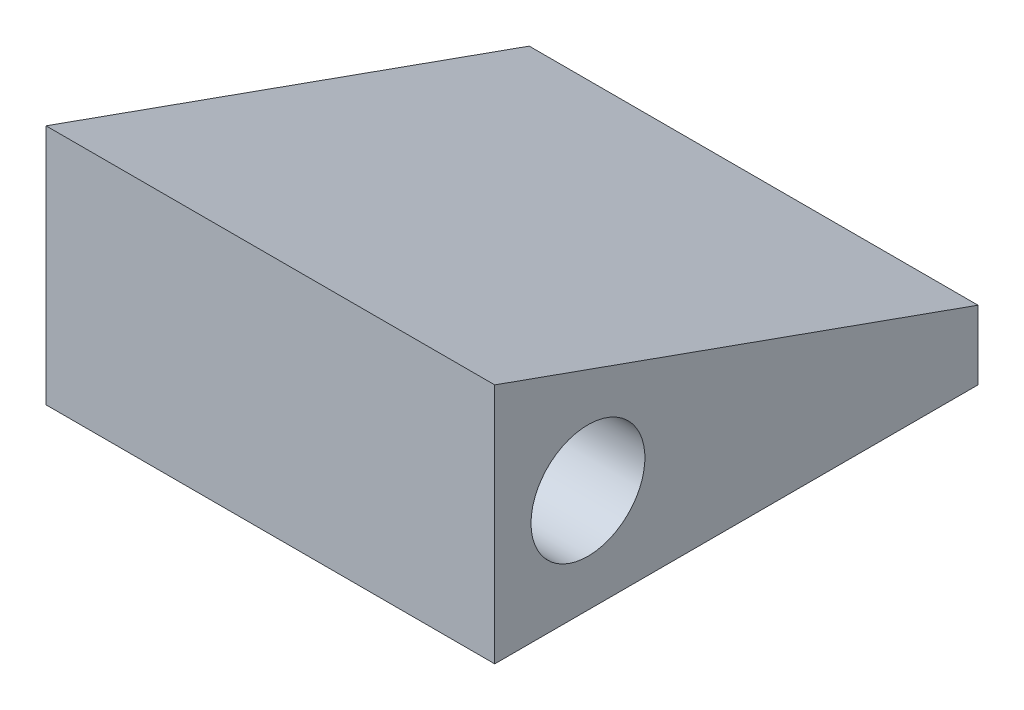
ISO-10303-21;
HEADER;
FILE_DESCRIPTION(('STEP AP214'),'2;1');
FILE_NAME('part.step','',(''),(''),'','','');
FILE_SCHEMA(('AUTOMOTIVE_DESIGN { 1 0 10303 214 1 1 1 1 }'));
ENDSEC;
DATA;
#1=APPLICATION_CONTEXT('core data for automotive mechanical design processes');
#2=APPLICATION_PROTOCOL_DEFINITION('international standard','automotive_design',2000,#1);
#3=PRODUCT_CONTEXT('',#1,'mechanical');
#4=PRODUCT('Part','Part','',(#3));
#5=PRODUCT_RELATED_PRODUCT_CATEGORY('part','',(#4));
#6=PRODUCT_DEFINITION_FORMATION('','',#4);
#7=PRODUCT_DEFINITION_CONTEXT('part definition',#1,'design');
#8=PRODUCT_DEFINITION('design','',#6,#7);
#9=PRODUCT_DEFINITION_SHAPE('','',#8);
#10=(LENGTH_UNIT() NAMED_UNIT(*) SI_UNIT(.MILLI.,.METRE.));
#11=(NAMED_UNIT(*) PLANE_ANGLE_UNIT() SI_UNIT($,.RADIAN.));
#12=(NAMED_UNIT(*) SI_UNIT($,.STERADIAN.) SOLID_ANGLE_UNIT());
#13=UNCERTAINTY_MEASURE_WITH_UNIT(LENGTH_MEASURE(1.E-05),#10,'distance_accuracy_value','');
#14=(GEOMETRIC_REPRESENTATION_CONTEXT(3) GLOBAL_UNCERTAINTY_ASSIGNED_CONTEXT((#13)) GLOBAL_UNIT_ASSIGNED_CONTEXT((#10,
#11,#12)) REPRESENTATION_CONTEXT('',''));
#15=CARTESIAN_POINT('',(0.,0.,0.));
#16=DIRECTION('',(0.,0.,1.));
#17=DIRECTION('',(1.,0.,0.));
#18=AXIS2_PLACEMENT_3D('',#15,#16,#17);
#19=CARTESIAN_POINT('',(6.5,2.,-7.));
#20=DIRECTION('',(-1.,0.,0.));
#21=DIRECTION('',(0.,0.,1.));
#22=AXIS2_PLACEMENT_3D('',#19,#20,#21);
#23=PLANE('',#22);
#24=CARTESIAN_POINT('',(6.5,3.,4.29999999999999));
#25=DIRECTION('',(-1.,0.,0.));
#26=DIRECTION('',(0.,0.,1.));
#27=AXIS2_PLACEMENT_3D('',#24,#25,#26);
#28=CIRCLE('',#27,1.65);
#29=CARTESIAN_POINT('',(6.5,3.,5.94999999999999));
#30=VERTEX_POINT('',#29);
#31=EDGE_CURVE('E104',#30,#30,#28,.T.);
#32=ORIENTED_EDGE('',*,*,#31,.T.);
#33=EDGE_LOOP('',(#32));
#34=FACE_BOUND('',#33,.T.);
#35=DIRECTION('',(0.,0.,-1.));
#36=VECTOR('',#35,1.);
#37=CARTESIAN_POINT('',(6.5,0.,-7.));
#38=LINE('',#37,#36);
#39=CARTESIAN_POINT('',(6.5,0.,7.));
#40=VERTEX_POINT('',#39);
#41=CARTESIAN_POINT('',(6.5,0.,-7.));
#42=VERTEX_POINT('',#41);
#43=EDGE_CURVE('E85',#40,#42,#38,.T.);
#44=ORIENTED_EDGE('',*,*,#43,.T.);
#45=DIRECTION('',(0.,-1.,0.));
#46=VECTOR('',#45,1.);
#47=CARTESIAN_POINT('',(6.5,2.,-7.));
#48=LINE('',#47,#46);
#49=CARTESIAN_POINT('',(6.5,2.,-7.));
#50=VERTEX_POINT('',#49);
#51=EDGE_CURVE('E11',#50,#42,#48,.T.);
#52=ORIENTED_EDGE('',*,*,#51,.F.);
#53=DIRECTION('',(0.,0.336336396998156,0.941741911594837));
#54=VECTOR('',#53,1.);
#55=CARTESIAN_POINT('',(6.5,7.,7.));
#56=LINE('',#55,#54);
#57=CARTESIAN_POINT('',(6.5,7.,7.));
#58=VERTEX_POINT('',#57);
#59=EDGE_CURVE('E87',#50,#58,#56,.T.);
#60=ORIENTED_EDGE('',*,*,#59,.T.);
#61=DIRECTION('',(0.,-1.,0.));
#62=VECTOR('',#61,1.);
#63=CARTESIAN_POINT('',(6.5,2.,7.));
#64=LINE('',#63,#62);
#65=EDGE_CURVE('E74',#58,#40,#64,.T.);
#66=ORIENTED_EDGE('',*,*,#65,.T.);
#67=EDGE_LOOP('',(#44,#52,#60,#66));
#68=FACE_BOUND('',#67,.T.);
#69=ADVANCED_FACE('F33',(#34,#68),#23,.F.);
#70=CARTESIAN_POINT('',(-6.5,2.,-7.));
#71=DIRECTION('',(0.,0.,1.));
#72=DIRECTION('',(1.,0.,0.));
#73=AXIS2_PLACEMENT_3D('',#70,#71,#72);
#74=PLANE('',#73);
#75=DIRECTION('',(-1.,0.,0.));
#76=VECTOR('',#75,1.);
#77=CARTESIAN_POINT('',(-6.5,0.,-7.));
#78=LINE('',#77,#76);
#79=CARTESIAN_POINT('',(-6.5,0.,-7.));
#80=VERTEX_POINT('',#79);
#81=EDGE_CURVE('E90',#42,#80,#78,.T.);
#82=ORIENTED_EDGE('',*,*,#81,.T.);
#83=DIRECTION('',(0.,-1.,0.));
#84=VECTOR('',#83,1.);
#85=CARTESIAN_POINT('',(-6.5,2.,-7.));
#86=LINE('',#85,#84);
#87=CARTESIAN_POINT('',(-6.5,2.,-7.));
#88=VERTEX_POINT('',#87);
#89=EDGE_CURVE('E41',#88,#80,#86,.T.);
#90=ORIENTED_EDGE('',*,*,#89,.F.);
#91=DIRECTION('',(-1.,0.,0.));
#92=VECTOR('',#91,1.);
#93=CARTESIAN_POINT('',(-6.5,2.,-7.));
#94=LINE('',#93,#92);
#95=EDGE_CURVE('E79',#50,#88,#94,.T.);
#96=ORIENTED_EDGE('',*,*,#95,.F.);
#97=ORIENTED_EDGE('',*,*,#51,.T.);
#98=EDGE_LOOP('',(#82,#90,#96,#97));
#99=FACE_BOUND('',#98,.T.);
#100=ADVANCED_FACE('F122',(#99),#74,.F.);
#101=CARTESIAN_POINT('',(-6.5,2.,-7.));
#102=DIRECTION('',(1.,0.,0.));
#103=DIRECTION('',(0.,0.,-1.));
#104=AXIS2_PLACEMENT_3D('',#101,#102,#103);
#105=PLANE('',#104);
#106=CARTESIAN_POINT('',(-6.5,3.,4.3));
#107=DIRECTION('',(-1.,0.,0.));
#108=DIRECTION('',(0.,0.,1.));
#109=AXIS2_PLACEMENT_3D('',#106,#107,#108);
#110=CIRCLE('',#109,1.65);
#111=CARTESIAN_POINT('',(-6.5,3.,5.95));
#112=VERTEX_POINT('',#111);
#113=EDGE_CURVE('E107',#112,#112,#110,.T.);
#114=ORIENTED_EDGE('',*,*,#113,.F.);
#115=EDGE_LOOP('',(#114));
#116=FACE_BOUND('',#115,.T.);
#117=DIRECTION('',(0.,0.,1.));
#118=VECTOR('',#117,1.);
#119=CARTESIAN_POINT('',(-6.5,0.,-7.));
#120=LINE('',#119,#118);
#121=CARTESIAN_POINT('',(-6.5,0.,7.));
#122=VERTEX_POINT('',#121);
#123=EDGE_CURVE('E63',#80,#122,#120,.T.);
#124=ORIENTED_EDGE('',*,*,#123,.T.);
#125=DIRECTION('',(0.,-1.,0.));
#126=VECTOR('',#125,1.);
#127=CARTESIAN_POINT('',(-6.5,2.,7.));
#128=LINE('',#127,#126);
#129=CARTESIAN_POINT('',(-6.5,7.,7.));
#130=VERTEX_POINT('',#129);
#131=EDGE_CURVE('E76',#130,#122,#128,.T.);
#132=ORIENTED_EDGE('',*,*,#131,.F.);
#133=DIRECTION('',(0.,0.336336396998156,0.941741911594837));
#134=VECTOR('',#133,1.);
#135=CARTESIAN_POINT('',(-6.5,7.,7.));
#136=LINE('',#135,#134);
#137=EDGE_CURVE('E94',#88,#130,#136,.T.);
#138=ORIENTED_EDGE('',*,*,#137,.F.);
#139=ORIENTED_EDGE('',*,*,#89,.T.);
#140=EDGE_LOOP('',(#124,#132,#138,#139));
#141=FACE_BOUND('',#140,.T.);
#142=ADVANCED_FACE('F100',(#116,#141),#105,.F.);
#143=CARTESIAN_POINT('',(-6.5,2.,7.));
#144=DIRECTION('',(0.,0.,-1.));
#145=DIRECTION('',(-1.,0.,0.));
#146=AXIS2_PLACEMENT_3D('',#143,#144,#145);
#147=PLANE('',#146);
#148=DIRECTION('',(1.,0.,0.));
#149=VECTOR('',#148,1.);
#150=CARTESIAN_POINT('',(-6.5,0.,7.));
#151=LINE('',#150,#149);
#152=EDGE_CURVE('E69',#122,#40,#151,.T.);
#153=ORIENTED_EDGE('',*,*,#152,.T.);
#154=ORIENTED_EDGE('',*,*,#65,.F.);
#155=DIRECTION('',(1.,0.,0.));
#156=VECTOR('',#155,1.);
#157=CARTESIAN_POINT('',(-6.5,7.,7.));
#158=LINE('',#157,#156);
#159=EDGE_CURVE('E91',#130,#58,#158,.T.);
#160=ORIENTED_EDGE('',*,*,#159,.F.);
#161=ORIENTED_EDGE('',*,*,#131,.T.);
#162=EDGE_LOOP('',(#153,#154,#160,#161));
#163=FACE_BOUND('',#162,.T.);
#164=ADVANCED_FACE('F71',(#163),#147,.F.);
#165=CARTESIAN_POINT('',(0.,0.,0.));
#166=DIRECTION('',(0.,1.,0.));
#167=DIRECTION('',(0.,0.,1.));
#168=AXIS2_PLACEMENT_3D('',#165,#166,#167);
#169=PLANE('',#168);
#170=ORIENTED_EDGE('',*,*,#43,.F.);
#171=ORIENTED_EDGE('',*,*,#152,.F.);
#172=ORIENTED_EDGE('',*,*,#123,.F.);
#173=ORIENTED_EDGE('',*,*,#81,.F.);
#174=EDGE_LOOP('',(#170,#171,#172,#173));
#175=FACE_BOUND('',#174,.T.);
#176=ADVANCED_FACE('F89',(#175),#169,.F.);
#177=CARTESIAN_POINT('',(-6.5,7.,7.));
#178=DIRECTION('',(0.,0.941741911594837,-0.336336396998156));
#179=DIRECTION('',(0.,0.336336396998156,0.941741911594838));
#180=AXIS2_PLACEMENT_3D('',#177,#178,#179);
#181=PLANE('',#180);
#182=ORIENTED_EDGE('',*,*,#59,.F.);
#183=ORIENTED_EDGE('',*,*,#95,.T.);
#184=ORIENTED_EDGE('',*,*,#137,.T.);
#185=ORIENTED_EDGE('',*,*,#159,.T.);
#186=EDGE_LOOP('',(#182,#183,#184,#185));
#187=FACE_BOUND('',#186,.T.);
#188=ADVANCED_FACE('F117',(#187),#181,.T.);
#189=CARTESIAN_POINT('',(6.5,3.,4.29999999999999));
#190=DIRECTION('',(-1.,0.,0.));
#191=DIRECTION('',(0.,0.,1.));
#192=AXIS2_PLACEMENT_3D('',#189,#190,#191);
#193=CYLINDRICAL_SURFACE('',#192,1.65);
#194=CARTESIAN_POINT('',(6.5,3.,5.94999999999999));
#195=CARTESIAN_POINT('',(6.36458333333333,3.,5.94999999999999));
#196=CARTESIAN_POINT('',(6.22916666666667,3.,5.94999999999999));
#197=CARTESIAN_POINT('',(5.95833333333333,3.,5.94999999999999));
#198=CARTESIAN_POINT('',(5.82291666666667,3.,5.94999999999999));
#199=CARTESIAN_POINT('',(5.55208333333333,3.,5.94999999999999));
#200=CARTESIAN_POINT('',(5.41666666666667,3.,5.94999999999999));
#201=CARTESIAN_POINT('',(5.14583333333333,3.,5.94999999999999));
#202=CARTESIAN_POINT('',(5.01041666666667,3.,5.94999999999999));
#203=CARTESIAN_POINT('',(4.73958333333333,3.,5.94999999999999));
#204=CARTESIAN_POINT('',(4.60416666666667,3.,5.95));
#205=CARTESIAN_POINT('',(4.33333333333333,3.,5.95));
#206=CARTESIAN_POINT('',(4.19791666666667,3.,5.95));
#207=CARTESIAN_POINT('',(3.92708333333333,3.,5.95));
#208=CARTESIAN_POINT('',(3.79166666666667,3.,5.95));
#209=CARTESIAN_POINT('',(3.52083333333333,3.,5.95));
#210=CARTESIAN_POINT('',(3.38541666666667,3.,5.95));
#211=CARTESIAN_POINT('',(3.11458333333333,3.,5.95));
#212=CARTESIAN_POINT('',(2.97916666666667,3.,5.95));
#213=CARTESIAN_POINT('',(2.70833333333333,3.,5.95));
#214=CARTESIAN_POINT('',(2.57291666666667,3.,5.95));
#215=CARTESIAN_POINT('',(2.30208333333333,3.,5.95));
#216=CARTESIAN_POINT('',(2.16666666666667,3.,5.95));
#217=CARTESIAN_POINT('',(1.89583333333333,3.,5.95));
#218=CARTESIAN_POINT('',(1.76041666666667,3.,5.95));
#219=CARTESIAN_POINT('',(1.48958333333333,3.,5.95));
#220=CARTESIAN_POINT('',(1.35416666666667,3.,5.95));
#221=CARTESIAN_POINT('',(1.08333333333333,3.,5.95));
#222=CARTESIAN_POINT('',(0.947916666666667,3.,5.95));
#223=CARTESIAN_POINT('',(0.677083333333333,3.,5.95));
#224=CARTESIAN_POINT('',(0.541666666666667,3.,5.95));
#225=CARTESIAN_POINT('',(0.270833333333334,3.,5.95));
#226=CARTESIAN_POINT('',(0.135416666666667,3.,5.95));
#227=CARTESIAN_POINT('',(-0.135416666666667,3.,5.95));
#228=CARTESIAN_POINT('',(-0.270833333333334,3.,5.95));
#229=CARTESIAN_POINT('',(-0.541666666666667,3.,5.95));
#230=CARTESIAN_POINT('',(-0.677083333333333,3.,5.95));
#231=CARTESIAN_POINT('',(-0.947916666666667,3.,5.95));
#232=CARTESIAN_POINT('',(-1.08333333333333,3.,5.95));
#233=CARTESIAN_POINT('',(-1.35416666666667,3.,5.95));
#234=CARTESIAN_POINT('',(-1.48958333333333,3.,5.95));
#235=CARTESIAN_POINT('',(-1.76041666666667,3.,5.95));
#236=CARTESIAN_POINT('',(-1.89583333333333,3.,5.95));
#237=CARTESIAN_POINT('',(-2.16666666666667,3.,5.95));
#238=CARTESIAN_POINT('',(-2.30208333333333,3.,5.95));
#239=CARTESIAN_POINT('',(-2.57291666666667,3.,5.95));
#240=CARTESIAN_POINT('',(-2.70833333333333,3.,5.95));
#241=CARTESIAN_POINT('',(-2.97916666666667,3.,5.95));
#242=CARTESIAN_POINT('',(-3.11458333333333,3.,5.95));
#243=CARTESIAN_POINT('',(-3.38541666666667,3.,5.95));
#244=CARTESIAN_POINT('',(-3.52083333333333,3.,5.95));
#245=CARTESIAN_POINT('',(-3.79166666666667,3.,5.95));
#246=CARTESIAN_POINT('',(-3.92708333333333,3.,5.95));
#247=CARTESIAN_POINT('',(-4.19791666666667,3.,5.95));
#248=CARTESIAN_POINT('',(-4.33333333333333,3.,5.95));
#249=CARTESIAN_POINT('',(-4.60416666666667,3.,5.95));
#250=CARTESIAN_POINT('',(-4.73958333333333,3.,5.95));
#251=CARTESIAN_POINT('',(-5.01041666666667,3.,5.95));
#252=CARTESIAN_POINT('',(-5.14583333333333,3.,5.95));
#253=CARTESIAN_POINT('',(-5.41666666666667,3.,5.95));
#254=CARTESIAN_POINT('',(-5.55208333333333,3.,5.95));
#255=CARTESIAN_POINT('',(-5.82291666666667,3.,5.95));
#256=CARTESIAN_POINT('',(-5.95833333333333,3.,5.95));
#257=CARTESIAN_POINT('',(-6.22916666666667,3.,5.95));
#258=CARTESIAN_POINT('',(-6.36458333333333,3.,5.95));
#259=CARTESIAN_POINT('',(-6.5,3.,5.95));
#260=B_SPLINE_CURVE_WITH_KNOTS('',3,(#194,#195,#196,#197,#198,#199,#200,#201,#202,#203,#204,
#205,#206,#207,#208,#209,#210,#211,#212,#213,#214,#215,#216,#217,#218,#219,#220,#221,#222,#223,
#224,#225,#226,#227,#228,#229,#230,#231,#232,#233,#234,#235,#236,#237,#238,#239,#240,#241,#242,
#243,#244,#245,#246,#247,#248,#249,#250,#251,#252,#253,#254,#255,#256,#257,#258,#259),
.UNSPECIFIED.,.F.,.F.,(4,2,2,2,2,2,2,2,2,2,2,2,2,2,2,2,2,2,2,2,2,2,2,2,2,2,2,2,2,2,2,2,4),(0.,
0.40625,0.8125,1.21875,1.625,2.03125,2.4375,2.84375,3.25,3.65625,4.0625,4.46875,4.875,5.28125,
5.6875,6.09375,6.5,6.90625,7.3125,7.71875,8.125,8.53125,8.9375,9.34375,9.75,10.15625,10.5625,
10.96875,11.375,11.78125,12.1875,12.59375,13.),.UNSPECIFIED.);
#261=EDGE_CURVE('BSEAM114',#30,#112,#260,.T.);
#262=ORIENTED_EDGE('',*,*,#31,.F.);
#263=ORIENTED_EDGE('',*,*,#113,.T.);
#264=ORIENTED_EDGE('',*,*,#261,.T.);
#265=ORIENTED_EDGE('',*,*,#261,.F.);
#266=EDGE_LOOP('',(#262,#264,#263,#265));
#267=FACE_BOUND('',#266,.T.);
#268=ADVANCED_FACE('F114',(#267),#193,.F.);
#269=CLOSED_SHELL('',(#69,#100,#142,#164,#176,#188,#268));
#270=MANIFOLD_SOLID_BREP('B2',#269);
#271=ADVANCED_BREP_SHAPE_REPRESENTATION('',(#18,#270),#14);
#272=SHAPE_DEFINITION_REPRESENTATION(#9,#271);
ENDSEC;
END-ISO-10303-21;
